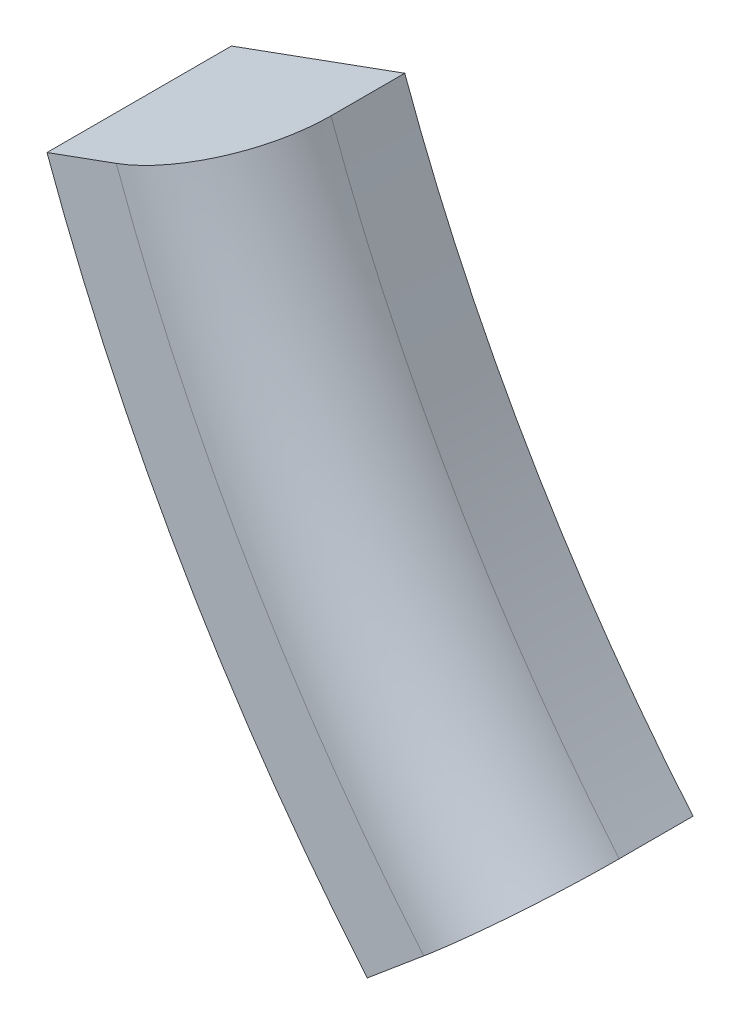
ISO-10303-21;
HEADER;
FILE_DESCRIPTION(('STEP AP214'),'2;1');
FILE_NAME('part.step','',(''),(''),'','','');
FILE_SCHEMA(('AUTOMOTIVE_DESIGN { 1 0 10303 214 1 1 1 1 }'));
ENDSEC;
DATA;
#1=APPLICATION_CONTEXT('core data for automotive mechanical design processes');
#2=APPLICATION_PROTOCOL_DEFINITION('international standard','automotive_design',2000,#1);
#3=PRODUCT_CONTEXT('',#1,'mechanical');
#4=PRODUCT('Part','Part','',(#3));
#5=PRODUCT_RELATED_PRODUCT_CATEGORY('part','',(#4));
#6=PRODUCT_DEFINITION_FORMATION('','',#4);
#7=PRODUCT_DEFINITION_CONTEXT('part definition',#1,'design');
#8=PRODUCT_DEFINITION('design','',#6,#7);
#9=PRODUCT_DEFINITION_SHAPE('','',#8);
#10=(LENGTH_UNIT() NAMED_UNIT(*) SI_UNIT(.MILLI.,.METRE.));
#11=(NAMED_UNIT(*) PLANE_ANGLE_UNIT() SI_UNIT($,.RADIAN.));
#12=(NAMED_UNIT(*) SI_UNIT($,.STERADIAN.) SOLID_ANGLE_UNIT());
#13=UNCERTAINTY_MEASURE_WITH_UNIT(LENGTH_MEASURE(1.E-05),#10,'distance_accuracy_value','');
#14=(GEOMETRIC_REPRESENTATION_CONTEXT(3) GLOBAL_UNCERTAINTY_ASSIGNED_CONTEXT((#13)) GLOBAL_UNIT_ASSIGNED_CONTEXT((#10,
#11,#12)) REPRESENTATION_CONTEXT('',''));
#15=CARTESIAN_POINT('',(0.,0.,0.));
#16=DIRECTION('',(0.,0.,1.));
#17=DIRECTION('',(1.,0.,0.));
#18=AXIS2_PLACEMENT_3D('',#15,#16,#17);
#19=CARTESIAN_POINT('',(0.,0.,4.4));
#20=DIRECTION('',(0.,0.,-1.));
#21=DIRECTION('',(-1.,0.,0.));
#22=AXIS2_PLACEMENT_3D('',#19,#20,#21);
#23=CYLINDRICAL_SURFACE('',#22,8.99999999999983);
#24=DIRECTION('',(0.,0.,1.));
#25=VECTOR('',#24,1.);
#26=CARTESIAN_POINT('',(-6.89439998807068,-5.78508848717873,4.9));
#27=LINE('',#26,#25);
#28=CARTESIAN_POINT('',(-6.89439998807068,-5.78508848717873,4.4));
#29=VERTEX_POINT('',#28);
#30=CARTESIAN_POINT('',(-6.89439998807059,-5.78508848717884,4.8));
#31=VERTEX_POINT('',#30);
#32=EDGE_CURVE('E75',#29,#31,#27,.T.);
#33=ORIENTED_EDGE('',*,*,#32,.F.);
#34=CARTESIAN_POINT('',(0.,0.,4.4));
#35=DIRECTION('',(0.,0.,-1.));
#36=DIRECTION('',(-0.939692620785907,-0.342020143325673,0.));
#37=AXIS2_PLACEMENT_3D('',#34,#35,#36);
#38=CIRCLE('',#37,8.99999999999983);
#39=CARTESIAN_POINT('',(-8.457233587073,-3.07818128993099,4.4));
#40=VERTEX_POINT('',#39);
#41=EDGE_CURVE('E110',#29,#40,#38,.T.);
#42=ORIENTED_EDGE('',*,*,#41,.T.);
#43=DIRECTION('',(0.,0.,-1.));
#44=VECTOR('',#43,1.);
#45=CARTESIAN_POINT('',(-8.457233587073,-3.078181289931,4.9));
#46=LINE('',#45,#44);
#47=CARTESIAN_POINT('',(-8.45723358707291,-3.07818128993105,4.8));
#48=VERTEX_POINT('',#47);
#49=EDGE_CURVE('E104',#48,#40,#46,.T.);
#50=ORIENTED_EDGE('',*,*,#49,.F.);
#51=CARTESIAN_POINT('',(0.,0.,4.8));
#52=DIRECTION('',(0.,0.,-1.));
#53=DIRECTION('',(-1.,0.,0.));
#54=AXIS2_PLACEMENT_3D('',#51,#52,#53);
#55=CIRCLE('',#54,8.99999999999983);
#56=EDGE_CURVE('E72',#48,#31,#55,.F.);
#57=ORIENTED_EDGE('',*,*,#56,.T.);
#58=EDGE_LOOP('',(#33,#42,#50,#57));
#59=FACE_BOUND('',#58,.T.);
#60=ADVANCED_FACE('F16',(#59),#23,.F.);
#61=CARTESIAN_POINT('',(-9.09475687118519,-3.10569241349145,5.4));
#62=CARTESIAN_POINT('',(-9.07833784708835,-3.15080330946452,5.4));
#63=CARTESIAN_POINT('',(-9.06190913879676,-3.19594081254797,5.4));
#64=CARTESIAN_POINT('',(-9.04547074630837,-3.24110492274178,5.4));
#65=CARTESIAN_POINT('',(-8.7422379085315,-4.07423026091271,5.4));
#66=CARTESIAN_POINT('',(-8.36376399062098,-4.82881356761603,5.4));
#67=CARTESIAN_POINT('',(-7.89949766147291,-5.53389478292716,5.4));
#68=CARTESIAN_POINT('',(-7.3296144492231,-6.21305513959728,5.4));
#69=CARTESIAN_POINT('',(-7.29872037929392,-6.24987325794235,5.4));
#70=CARTESIAN_POINT('',(-7.26784450699902,-6.28666968919234,5.4));
#71=CARTESIAN_POINT('',(-7.23698683233736,-6.3234444333462,5.4));
#72=CARTESIAN_POINT('',(-9.0907700936201,-3.10424134320972,5.4));
#73=CARTESIAN_POINT('',(-9.07434380638518,-3.14937219451876,5.4));
#74=CARTESIAN_POINT('',(-9.05791267705338,-3.19451634938298,5.4));
#75=CARTESIAN_POINT('',(-9.04147670562269,-3.23967380780239,5.4));
#76=CARTESIAN_POINT('',(-8.73837776965825,-4.07243125425336,5.4));
#77=CARTESIAN_POINT('',(-8.36007092343899,-4.82668145542102,5.4));
#78=CARTESIAN_POINT('',(-7.89600964695246,-5.53145125944508,5.4));
#79=CARTESIAN_POINT('',(-7.32637804665955,-6.21031175678014,5.4));
#80=CARTESIAN_POINT('',(-7.29548852614196,-6.24712445335418,5.4));
#81=CARTESIAN_POINT('',(-7.26460810444201,-6.28392630638067,5.4));
#82=CARTESIAN_POINT('',(-7.23373678155868,-6.3207173158586,5.4));
#83=CARTESIAN_POINT('',(-9.086783316055,-3.102790272928,5.4));
#84=CARTESIAN_POINT('',(-9.070349765682,-3.147941079573,5.4));
#85=CARTESIAN_POINT('',(-9.05391621531,-3.193091886218,5.4));
#86=CARTESIAN_POINT('',(-9.037482664937,-3.238242692863,5.4));
#87=CARTESIAN_POINT('',(-8.734517630785,-4.070632247594,5.4));
#88=CARTESIAN_POINT('',(-8.356377856257,-4.824549343226,5.4));
#89=CARTESIAN_POINT('',(-7.892521632432,-5.529007735963,5.4));
#90=CARTESIAN_POINT('',(-7.323141644096,-6.207568373963,5.4));
#91=CARTESIAN_POINT('',(-7.29225667299,-6.244375648766,5.4));
#92=CARTESIAN_POINT('',(-7.261371701885,-6.281182923569,5.4));
#93=CARTESIAN_POINT('',(-7.23048673078,-6.317990198371,5.4));
#94=CARTESIAN_POINT('',(-8.522967825783,-2.897577945691,5.4));
#95=CARTESIAN_POINT('',(-8.505507112572,-2.945550863012,5.4));
#96=CARTESIAN_POINT('',(-8.488731175411,-2.991642373516,5.4));
#97=CARTESIAN_POINT('',(-8.472640014301,-3.035852477203,5.4));
#98=CARTESIAN_POINT('',(-8.188611556066,-3.816214285948,5.4));
#99=CARTESIAN_POINT('',(-7.834099286705,-4.523023144957,5.4));
#100=CARTESIAN_POINT('',(-7.399241888374,-5.18344133113,5.4));
#101=CARTESIAN_POINT('',(-6.865445204229,-5.819595455285,5.4));
#102=CARTESIAN_POINT('',(-6.83520361708,-5.855635975875,5.4));
#103=CARTESIAN_POINT('',(-6.803675262943,-5.893210005665,5.4));
#104=CARTESIAN_POINT('',(-6.770860141819,-5.932317544656,5.4));
#105=CARTESIAN_POINT('',(-8.522967825783,-2.897577945691,4.8));
#106=CARTESIAN_POINT('',(-8.505507112572,-2.945550863012,4.8));
#107=CARTESIAN_POINT('',(-8.488731175411,-2.991642373516,4.8));
#108=CARTESIAN_POINT('',(-8.472640014301,-3.035852477203,4.8));
#109=CARTESIAN_POINT('',(-8.188611556066,-3.816214285948,4.8));
#110=CARTESIAN_POINT('',(-7.834099286705,-4.523023144957,4.8));
#111=CARTESIAN_POINT('',(-7.399241888374,-5.18344133113,4.8));
#112=CARTESIAN_POINT('',(-6.865445204229,-5.819595455285,4.8));
#113=CARTESIAN_POINT('',(-6.83520361708,-5.855635975875,4.8));
#114=CARTESIAN_POINT('',(-6.803675262943,-5.893210005665,4.8));
#115=CARTESIAN_POINT('',(-6.770860141819,-5.932317544656,4.8));
#116=(BOUNDED_SURFACE() B_SPLINE_SURFACE(2,4,((#61,#62,#63,#64,#65,#66,#67,#68,#69,#70,#71),
(#72,#73,#74,#75,#76,#77,#78,#79,#80,#81,#82),(#83,#84,#85,#86,#87,#88,#89,#90,#91,#92,#93),
(#94,#95,#96,#97,#98,#99,#100,#101,#102,#103,#104),(#105,#106,#107,#108,#109,#110,#111,#112,
#113,#114,#115)),.UNSPECIFIED.,.F.,.F.,.F.) B_SPLINE_SURFACE_WITH_KNOTS((3,2,3),(5,3,3,5),
(-0.03141589780172,0.,3.141589780172),(-0.180181795257,-9.885218362374E-07,3.14158879165,
3.321772277996),.UNSPECIFIED.) GEOMETRIC_REPRESENTATION_ITEM() RATIONAL_B_SPLINE_SURFACE(((1.,
1.,1.,1.,1.,1.,1.,1.,1.,1.,1.),(1.,1.,1.,1.,1.,1.,1.,1.,1.,1.,1.),(1.,1.,1.,1.,1.,1.,1.,1.,1.,
1.,1.),(0.707106781187,0.707106781187,0.707106781187,0.707106781187,0.707106781187,
0.707106781187,0.707106781187,0.707106781187,0.707106781187,0.707106781187,0.707106781187),(1.,
1.,1.,1.,1.,1.,1.,1.,1.,1.,1.))) REPRESENTATION_ITEM('') SURFACE());
#117=CARTESIAN_POINT('',(-7.35402665394208,-6.17076105299086,5.4));
#118=CARTESIAN_POINT('',(-7.32816883812622,-6.14906376927673,5.40002866851908));
#119=CARTESIAN_POINT('',(-7.30231758378975,-6.12737199129754,5.39715321773089));
#120=CARTESIAN_POINT('',(-7.25136612617364,-6.08461864200393,5.38580563201007));
#121=CARTESIAN_POINT('',(-7.22626534975746,-6.06355658977086,5.37733788823875));
#122=CARTESIAN_POINT('',(-7.17749825156941,-6.0226361356677,5.35501130019537));
#123=CARTESIAN_POINT('',(-7.15383262489367,-6.00277831705251,5.34114986728705));
#124=CARTESIAN_POINT('',(-7.10862374267553,-5.96484356065735,5.30844147525679));
#125=CARTESIAN_POINT('',(-7.08708011416717,-5.94676630992178,5.28959539439858));
#126=CARTESIAN_POINT('',(-7.04672030504325,-5.91290040897152,5.24744729717677));
#127=CARTESIAN_POINT('',(-7.02790438677455,-5.897111978892,5.22414485270636));
#128=CARTESIAN_POINT('',(-6.99353671366822,-5.86827407706407,5.17374669911031));
#129=CARTESIAN_POINT('',(-6.97798490621617,-5.85522456116692,5.1466510511393));
#130=CARTESIAN_POINT('',(-6.95058280375398,-5.83223146709742,5.08943052303987));
#131=CARTESIAN_POINT('',(-6.93873362616772,-5.82228882655504,5.05930473205761));
#132=CARTESIAN_POINT('',(-6.91908401136179,-5.80580084201862,4.9968898138987));
#133=CARTESIAN_POINT('',(-6.91128120280297,-5.79925350823477,4.96460196633312));
#134=CARTESIAN_POINT('',(-6.9018849453938,-5.7913691121083,4.91009711046116));
#135=CARTESIAN_POINT('',(-6.8990797824181,-5.78901530088999,4.88822297814315));
#136=CARTESIAN_POINT('',(-6.89533755072566,-5.78587519565709,4.84423562035769));
#137=CARTESIAN_POINT('',(-6.89439783365414,-5.78508667940896,4.82212277872283));
#138=CARTESIAN_POINT('',(-6.89439998807062,-5.78508848717903,4.8));
#139=B_SPLINE_CURVE_WITH_KNOTS('',3,(#117,#118,#119,#120,#121,#122,#123,#124,#125,#126,#127,
#128,#129,#130,#131,#132,#133,#134,#135,#136,#137,#138),.UNSPECIFIED.,.F.,.F.,(4,2,2,2,2,2,2,2,
2,2,4),(0.,0.101130416411246,0.202181517804636,0.303281177396484,0.404363035714876,
0.5054546094861,0.606544553630538,0.707664976507386,0.80872607148398,0.875135423227742,
0.941450426663166),.UNSPECIFIED.);
#140=CARTESIAN_POINT('',(-7.3540266539423,-6.17076105299062,5.4));
#141=VERTEX_POINT('',#140);
#142=EDGE_CURVE('E113',#141,#31,#139,.T.);
#143=CARTESIAN_POINT('',(-9.02104915954451,-3.28339337592653,5.4));
#144=CARTESIAN_POINT('',(-8.989329852747,-3.27184849240069,5.40002866851909));
#145=CARTESIAN_POINT('',(-8.95761859479552,-3.26030653841521,5.39715321773088));
#146=CARTESIAN_POINT('',(-8.8951173794023,-3.23755795640662,5.38580563201006));
#147=CARTESIAN_POINT('',(-8.86432671890451,-3.22635107249203,5.37733788823874));
#148=CARTESIAN_POINT('',(-8.80450501702273,-3.20457775364391,5.35501130019535));
#149=CARTESIAN_POINT('',(-8.77547482830034,-3.19401162905384,5.34114986728702));
#150=CARTESIAN_POINT('',(-8.72001792446666,-3.17382696677382,5.30844147525676));
#151=CARTESIAN_POINT('',(-8.69359075184488,-3.16420826256368,5.28959539439853));
#152=CARTESIAN_POINT('',(-8.64408211673793,-3.1461885930456,5.2474472971767));
#153=CARTESIAN_POINT('',(-8.62100097606883,-3.13778774486914,5.22414485270628));
#154=CARTESIAN_POINT('',(-8.57884278394081,-3.12244341780407,5.17374669911021));
#155=CARTESIAN_POINT('',(-8.55976566794077,-3.11549991542441,5.14665105113919));
#156=CARTESIAN_POINT('',(-8.52615201313388,-3.1032655456098,5.08943052303975));
#157=CARTESIAN_POINT('',(-8.51161684505035,-3.09797517707735,5.05930473205748));
#158=CARTESIAN_POINT('',(-8.48751302418165,-3.08920210374906,4.99688981389856));
#159=CARTESIAN_POINT('',(-8.47794146251836,-3.08571834020818,4.96460196633298));
#160=CARTESIAN_POINT('',(-8.46641524647477,-3.08152314065459,4.91009711046104));
#161=CARTESIAN_POINT('',(-8.46297420467616,-3.08027070386503,4.88822297814306));
#162=CARTESIAN_POINT('',(-8.45838367792771,-3.07859988876899,4.84423562035764));
#163=CARTESIAN_POINT('',(-8.45723094428977,-3.07818032803674,4.8221227787228));
#164=CARTESIAN_POINT('',(-8.45723358707282,-3.07818128993111,4.8));
#165=B_SPLINE_CURVE_WITH_KNOTS('',3,(#143,#144,#145,#146,#147,#148,#149,#150,#151,#152,#153,
#154,#155,#156,#157,#158,#159,#160,#161,#162,#163,#164),.UNSPECIFIED.,.F.,.F.,(4,2,2,2,2,2,2,2,
2,2,4),(0.,0.101130416411291,0.202181517804728,0.303281177396619,0.404363035715056,
0.505454609486315,0.606544553630785,0.707664976507642,0.808726071484244,0.875135423227933,
0.941450426663282),.UNSPECIFIED.);
#166=CARTESIAN_POINT('',(-9.02104915954459,-3.28339337592653,5.4));
#167=VERTEX_POINT('',#166);
#168=EDGE_CURVE('E21',#167,#48,#165,.T.);
#169=CARTESIAN_POINT('',(0.,0.,5.4));
#170=DIRECTION('',(0.,0.,-1.));
#171=DIRECTION('',(-0.939692620785901,-0.342020143325689,0.));
#172=AXIS2_PLACEMENT_3D('',#169,#170,#171);
#173=CIRCLE('',#172,9.6);
#174=EDGE_CURVE('E69',#141,#167,#173,.T.);
#175=ORIENTED_EDGE('',*,*,#142,.T.);
#176=ORIENTED_EDGE('',*,*,#56,.F.);
#177=ORIENTED_EDGE('',*,*,#168,.F.);
#178=ORIENTED_EDGE('',*,*,#174,.F.);
#179=EDGE_LOOP('',(#175,#176,#177,#178));
#180=FACE_BOUND('',#179,.T.);
#181=ADVANCED_FACE('F68',(#180),#116,.F.);
#182=CARTESIAN_POINT('',(-9.396926207859,-3.420201433257,4.4));
#183=DIRECTION('',(0.,0.,1.));
#184=DIRECTION('',(0.939692620785813,0.342020143325932,0.));
#185=AXIS2_PLACEMENT_3D('',#182,#183,#184);
#186=PLANE('',#185);
#187=ORIENTED_EDGE('',*,*,#41,.F.);
#188=DIRECTION('',(-0.766044443118219,-0.642787609687444,0.));
#189=VECTOR('',#188,1.);
#190=CARTESIAN_POINT('',(-7.2774222096305,-6.10648229202213,4.4));
#191=LINE('',#190,#189);
#192=CARTESIAN_POINT('',(-7.66044443118996,-6.42787609686518,4.4));
#193=VERTEX_POINT('',#192);
#194=EDGE_CURVE('E96',#29,#193,#191,.T.);
#195=ORIENTED_EDGE('',*,*,#194,.T.);
#196=CARTESIAN_POINT('',(0.,0.,4.4));
#197=DIRECTION('',(0.,0.,-1.));
#198=DIRECTION('',(-0.939692620785897,-0.342020143325699,0.));
#199=AXIS2_PLACEMENT_3D('',#196,#197,#198);
#200=CIRCLE('',#199,10.);
#201=CARTESIAN_POINT('',(-9.39692620785901,-3.42020143325698,4.4));
#202=VERTEX_POINT('',#201);
#203=EDGE_CURVE('E83',#202,#193,#200,.F.);
#204=ORIENTED_EDGE('',*,*,#203,.F.);
#205=DIRECTION('',(-0.939692620785713,-0.342020143326205,0.));
#206=VECTOR('',#205,1.);
#207=CARTESIAN_POINT('',(-8.92707989746638,-3.249191361594,4.4));
#208=LINE('',#207,#206);
#209=EDGE_CURVE('E81',#40,#202,#208,.T.);
#210=ORIENTED_EDGE('',*,*,#209,.F.);
#211=EDGE_LOOP('',(#187,#195,#204,#210));
#212=FACE_BOUND('',#211,.T.);
#213=ADVANCED_FACE('F134',(#212),#186,.F.);
#214=CARTESIAN_POINT('',(-7.698746653346,-6.46001547735,4.35));
#215=DIRECTION('',(-0.642787609686381,0.766044443119111,0.));
#216=DIRECTION('',(0.,0.,1.));
#217=AXIS2_PLACEMENT_3D('',#214,#215,#216);
#218=PLANE('',#217);
#219=ORIENTED_EDGE('',*,*,#194,.F.);
#220=ORIENTED_EDGE('',*,*,#32,.T.);
#221=ORIENTED_EDGE('',*,*,#142,.F.);
#222=DIRECTION('',(0.766044443118847,0.642787609686695,0.));
#223=VECTOR('',#222,1.);
#224=CARTESIAN_POINT('',(-7.27742220963059,-6.10648229202166,5.4));
#225=LINE('',#224,#223);
#226=CARTESIAN_POINT('',(-7.66044443118996,-6.42787609686518,5.4));
#227=VERTEX_POINT('',#226);
#228=EDGE_CURVE('E77',#227,#141,#225,.T.);
#229=ORIENTED_EDGE('',*,*,#228,.F.);
#230=DIRECTION('',(0.,0.,1.));
#231=VECTOR('',#230,1.);
#232=CARTESIAN_POINT('',(-7.66044443119009,-6.42787609686507,4.9));
#233=LINE('',#232,#231);
#234=EDGE_CURVE('E92',#193,#227,#233,.T.);
#235=ORIENTED_EDGE('',*,*,#234,.F.);
#236=EDGE_LOOP('',(#219,#220,#221,#229,#235));
#237=FACE_BOUND('',#236,.T.);
#238=ADVANCED_FACE('F131',(#237),#218,.F.);
#239=CARTESIAN_POINT('',(-9.396926207859,-3.420201433257,5.4));
#240=DIRECTION('',(0.,0.,1.));
#241=DIRECTION('',(0.939692620785812,0.342020143325932,0.));
#242=AXIS2_PLACEMENT_3D('',#239,#240,#241);
#243=PLANE('',#242);
#244=ORIENTED_EDGE('',*,*,#228,.T.);
#245=ORIENTED_EDGE('',*,*,#174,.T.);
#246=DIRECTION('',(0.939692620785712,0.34202014332621,0.));
#247=VECTOR('',#246,1.);
#248=CARTESIAN_POINT('',(-8.92707989746638,-3.249191361594,5.4));
#249=LINE('',#248,#247);
#250=CARTESIAN_POINT('',(-9.39692620785903,-3.42020143325692,5.4));
#251=VERTEX_POINT('',#250);
#252=EDGE_CURVE('E41',#251,#167,#249,.T.);
#253=ORIENTED_EDGE('',*,*,#252,.F.);
#254=CARTESIAN_POINT('',(0.,0.,5.4));
#255=DIRECTION('',(0.,0.,-1.));
#256=DIRECTION('',(-0.939692620785897,-0.342020143325699,0.));
#257=AXIS2_PLACEMENT_3D('',#254,#255,#256);
#258=CIRCLE('',#257,10.);
#259=EDGE_CURVE('E32',#227,#251,#258,.T.);
#260=ORIENTED_EDGE('',*,*,#259,.F.);
#261=EDGE_LOOP('',(#244,#245,#253,#260));
#262=FACE_BOUND('',#261,.T.);
#263=ADVANCED_FACE('F76',(#262),#243,.T.);
#264=CARTESIAN_POINT('',(-9.443910838898,-3.437302440423,4.35));
#265=DIRECTION('',(-0.342020143325625,0.939692620785924,0.));
#266=DIRECTION('',(0.,0.,1.));
#267=AXIS2_PLACEMENT_3D('',#264,#265,#266);
#268=PLANE('',#267);
#269=ORIENTED_EDGE('',*,*,#209,.T.);
#270=DIRECTION('',(0.,0.,-1.));
#271=VECTOR('',#270,1.);
#272=CARTESIAN_POINT('',(-9.396926207859,-3.420201433257,4.9));
#273=LINE('',#272,#271);
#274=EDGE_CURVE('E11',#251,#202,#273,.T.);
#275=ORIENTED_EDGE('',*,*,#274,.F.);
#276=ORIENTED_EDGE('',*,*,#252,.T.);
#277=ORIENTED_EDGE('',*,*,#168,.T.);
#278=ORIENTED_EDGE('',*,*,#49,.T.);
#279=EDGE_LOOP('',(#269,#275,#276,#277,#278));
#280=FACE_BOUND('',#279,.T.);
#281=ADVANCED_FACE('F18',(#280),#268,.T.);
#282=CARTESIAN_POINT('',(0.,0.,4.4));
#283=DIRECTION('',(0.,0.,-1.));
#284=DIRECTION('',(-1.,0.,0.));
#285=AXIS2_PLACEMENT_3D('',#282,#283,#284);
#286=CYLINDRICAL_SURFACE('',#285,10.);
#287=ORIENTED_EDGE('',*,*,#259,.T.);
#288=ORIENTED_EDGE('',*,*,#274,.T.);
#289=ORIENTED_EDGE('',*,*,#203,.T.);
#290=ORIENTED_EDGE('',*,*,#234,.T.);
#291=EDGE_LOOP('',(#287,#288,#289,#290));
#292=FACE_BOUND('',#291,.T.);
#293=ADVANCED_FACE('F142',(#292),#286,.T.);
#294=CLOSED_SHELL('',(#60,#181,#213,#238,#263,#281,#293));
#295=MANIFOLD_SOLID_BREP('B1',#294);
#296=ADVANCED_BREP_SHAPE_REPRESENTATION('',(#18,#295),#14);
#297=SHAPE_DEFINITION_REPRESENTATION(#9,#296);
ENDSEC;
END-ISO-10303-21;
